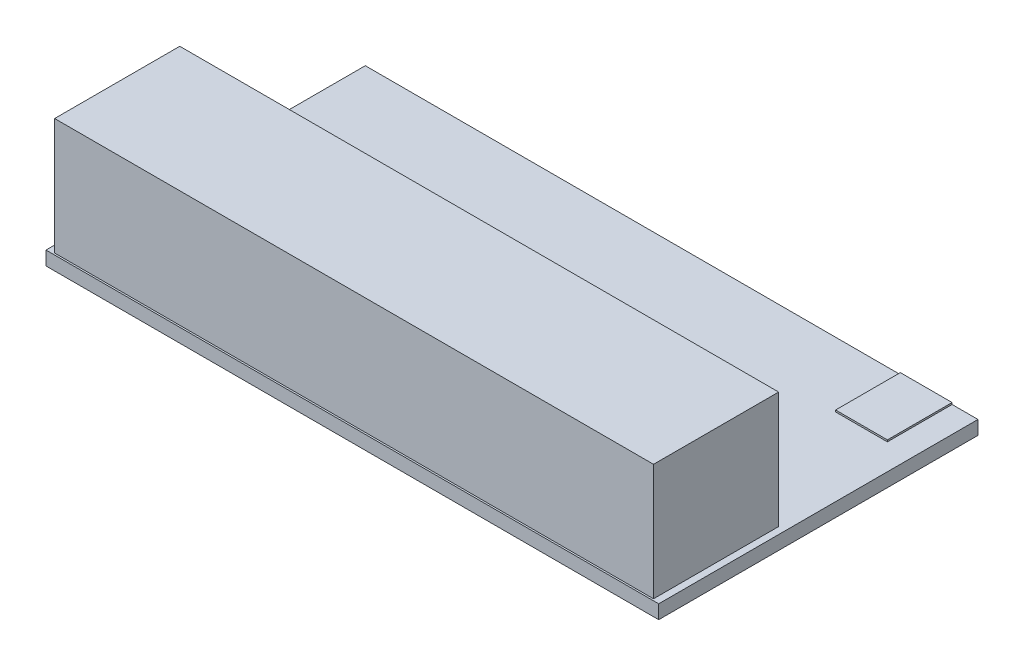
ISO-10303-21;
HEADER;
FILE_DESCRIPTION(('STEP AP214'),'2;1');
FILE_NAME('part.step','',(''),(''),'','','');
FILE_SCHEMA(('AUTOMOTIVE_DESIGN { 1 0 10303 214 1 1 1 1 }'));
ENDSEC;
DATA;
#1=APPLICATION_CONTEXT('core data for automotive mechanical design processes');
#2=APPLICATION_PROTOCOL_DEFINITION('international standard','automotive_design',2000,#1);
#3=PRODUCT_CONTEXT('',#1,'mechanical');
#4=PRODUCT('Part','Part','',(#3));
#5=PRODUCT_RELATED_PRODUCT_CATEGORY('part','',(#4));
#6=PRODUCT_DEFINITION_FORMATION('','',#4);
#7=PRODUCT_DEFINITION_CONTEXT('part definition',#1,'design');
#8=PRODUCT_DEFINITION('design','',#6,#7);
#9=PRODUCT_DEFINITION_SHAPE('','',#8);
#10=(LENGTH_UNIT() NAMED_UNIT(*) SI_UNIT(.MILLI.,.METRE.));
#11=(NAMED_UNIT(*) PLANE_ANGLE_UNIT() SI_UNIT($,.RADIAN.));
#12=(NAMED_UNIT(*) SI_UNIT($,.STERADIAN.) SOLID_ANGLE_UNIT());
#13=UNCERTAINTY_MEASURE_WITH_UNIT(LENGTH_MEASURE(1.E-05),#10,'distance_accuracy_value','');
#14=(GEOMETRIC_REPRESENTATION_CONTEXT(3) GLOBAL_UNCERTAINTY_ASSIGNED_CONTEXT((#13)) GLOBAL_UNIT_ASSIGNED_CONTEXT((#10,
#11,#12)) REPRESENTATION_CONTEXT('',''));
#15=CARTESIAN_POINT('',(0.,0.,0.));
#16=DIRECTION('',(0.,0.,1.));
#17=DIRECTION('',(1.,0.,0.));
#18=AXIS2_PLACEMENT_3D('',#15,#16,#17);
#19=CARTESIAN_POINT('',(0.,1.6,0.));
#20=DIRECTION('',(0.,-1.,0.));
#21=DIRECTION('',(0.,0.,-1.));
#22=AXIS2_PLACEMENT_3D('',#19,#20,#21);
#23=PLANE('',#22);
#24=DIRECTION('',(0.,0.,1.));
#25=VECTOR('',#24,1.);
#26=CARTESIAN_POINT('',(0.799999999999995,1.6,-14.7));
#27=LINE('',#26,#25);
#28=CARTESIAN_POINT('',(0.799999999999995,1.6,-14.7));
#29=VERTEX_POINT('',#28);
#30=CARTESIAN_POINT('',(0.799999999999993,1.6,-0.199999999999999));
#31=VERTEX_POINT('',#30);
#32=EDGE_CURVE('E144',#29,#31,#27,.T.);
#33=ORIENTED_EDGE('',*,*,#32,.F.);
#34=DIRECTION('',(-1.,0.,0.));
#35=VECTOR('',#34,1.);
#36=CARTESIAN_POINT('',(0.799999999999995,1.6,-14.7));
#37=LINE('',#36,#35);
#38=CARTESIAN_POINT('',(70.2,1.6,-14.7));
#39=VERTEX_POINT('',#38);
#40=EDGE_CURVE('E157',#39,#29,#37,.T.);
#41=ORIENTED_EDGE('',*,*,#40,.F.);
#42=DIRECTION('',(0.,0.,-1.));
#43=VECTOR('',#42,1.);
#44=CARTESIAN_POINT('',(70.2,1.6,-14.7));
#45=LINE('',#44,#43);
#46=CARTESIAN_POINT('',(70.2,1.6,-0.199999999999999));
#47=VERTEX_POINT('',#46);
#48=EDGE_CURVE('E166',#47,#39,#45,.T.);
#49=ORIENTED_EDGE('',*,*,#48,.F.);
#50=DIRECTION('',(1.,0.,0.));
#51=VECTOR('',#50,1.);
#52=CARTESIAN_POINT('',(0.799999999999993,1.6,-0.199999999999999));
#53=LINE('',#52,#51);
#54=EDGE_CURVE('E147',#31,#47,#53,.T.);
#55=ORIENTED_EDGE('',*,*,#54,.F.);
#56=EDGE_LOOP('',(#33,#41,#49,#55));
#57=FACE_BOUND('',#56,.T.);
#58=DIRECTION('',(0.,0.,-1.));
#59=VECTOR('',#58,1.);
#60=CARTESIAN_POINT('',(68.,1.6,-29.5));
#61=LINE('',#60,#59);
#62=CARTESIAN_POINT('',(68.,1.6,-29.5));
#63=VERTEX_POINT('',#62);
#64=CARTESIAN_POINT('',(68.,1.6,-37.));
#65=VERTEX_POINT('',#64);
#66=EDGE_CURVE('E49',#63,#65,#61,.T.);
#67=ORIENTED_EDGE('',*,*,#66,.F.);
#68=DIRECTION('',(1.,0.,0.));
#69=VECTOR('',#68,1.);
#70=CARTESIAN_POINT('',(68.,1.6,-29.5));
#71=LINE('',#70,#69);
#72=CARTESIAN_POINT('',(62.,1.6,-29.5));
#73=VERTEX_POINT('',#72);
#74=EDGE_CURVE('E53',#73,#63,#71,.T.);
#75=ORIENTED_EDGE('',*,*,#74,.F.);
#76=DIRECTION('',(0.,0.,1.));
#77=VECTOR('',#76,1.);
#78=CARTESIAN_POINT('',(62.,1.6,-29.5));
#79=LINE('',#78,#77);
#80=CARTESIAN_POINT('',(62.,1.6,-37.));
#81=VERTEX_POINT('',#80);
#82=EDGE_CURVE('E222',#81,#73,#79,.T.);
#83=ORIENTED_EDGE('',*,*,#82,.F.);
#84=DIRECTION('',(-1.,0.,0.));
#85=VECTOR('',#84,1.);
#86=CARTESIAN_POINT('',(0.,1.6,-37.));
#87=LINE('',#86,#85);
#88=CARTESIAN_POINT('',(0.,1.6,-37.));
#89=VERTEX_POINT('',#88);
#90=EDGE_CURVE('E191',#81,#89,#87,.T.);
#91=ORIENTED_EDGE('',*,*,#90,.T.);
#92=DIRECTION('',(0.,0.,1.));
#93=VECTOR('',#92,1.);
#94=CARTESIAN_POINT('',(0.,1.6,0.));
#95=LINE('',#94,#93);
#96=CARTESIAN_POINT('',(0.,1.6,0.));
#97=VERTEX_POINT('',#96);
#98=EDGE_CURVE('E183',#89,#97,#95,.T.);
#99=ORIENTED_EDGE('',*,*,#98,.T.);
#100=DIRECTION('',(1.,0.,0.));
#101=VECTOR('',#100,1.);
#102=CARTESIAN_POINT('',(0.,1.6,0.));
#103=LINE('',#102,#101);
#104=CARTESIAN_POINT('',(71.,1.6,0.));
#105=VERTEX_POINT('',#104);
#106=EDGE_CURVE('E186',#97,#105,#103,.T.);
#107=ORIENTED_EDGE('',*,*,#106,.T.);
#108=DIRECTION('',(0.,0.,-1.));
#109=VECTOR('',#108,1.);
#110=CARTESIAN_POINT('',(71.,1.6,0.));
#111=LINE('',#110,#109);
#112=CARTESIAN_POINT('',(71.,1.6,-37.));
#113=VERTEX_POINT('',#112);
#114=EDGE_CURVE('E189',#105,#113,#111,.T.);
#115=ORIENTED_EDGE('',*,*,#114,.T.);
#116=EDGE_CURVE('E192',#113,#65,#87,.T.);
#117=ORIENTED_EDGE('',*,*,#116,.T.);
#118=EDGE_LOOP('',(#67,#75,#83,#91,#99,#107,#115,#117));
#119=FACE_BOUND('',#118,.T.);
#120=ADVANCED_FACE('F34',(#57,#119),#23,.F.);
#121=CARTESIAN_POINT('',(0.,1.6,0.));
#122=DIRECTION('',(1.,0.,0.));
#123=DIRECTION('',(0.,0.,-1.));
#124=AXIS2_PLACEMENT_3D('',#121,#122,#123);
#125=PLANE('',#124);
#126=DIRECTION('',(0.,0.,1.));
#127=VECTOR('',#126,1.);
#128=CARTESIAN_POINT('',(0.,0.,0.));
#129=LINE('',#128,#127);
#130=CARTESIAN_POINT('',(0.,0.,-37.));
#131=VERTEX_POINT('',#130);
#132=CARTESIAN_POINT('',(0.,0.,0.));
#133=VERTEX_POINT('',#132);
#134=EDGE_CURVE('E182',#131,#133,#129,.T.);
#135=ORIENTED_EDGE('',*,*,#134,.T.);
#136=DIRECTION('',(0.,-1.,0.));
#137=VECTOR('',#136,1.);
#138=CARTESIAN_POINT('',(0.,1.6,0.));
#139=LINE('',#138,#137);
#140=EDGE_CURVE('E11',#97,#133,#139,.T.);
#141=ORIENTED_EDGE('',*,*,#140,.F.);
#142=ORIENTED_EDGE('',*,*,#98,.F.);
#143=DIRECTION('',(0.,-1.,0.));
#144=VECTOR('',#143,1.);
#145=CARTESIAN_POINT('',(0.,1.6,-37.));
#146=LINE('',#145,#144);
#147=EDGE_CURVE('E194',#89,#131,#146,.T.);
#148=ORIENTED_EDGE('',*,*,#147,.T.);
#149=EDGE_LOOP('',(#135,#141,#142,#148));
#150=FACE_BOUND('',#149,.T.);
#151=ADVANCED_FACE('F36',(#150),#125,.F.);
#152=CARTESIAN_POINT('',(0.,1.6,0.));
#153=DIRECTION('',(0.,0.,-1.));
#154=DIRECTION('',(-1.,0.,0.));
#155=AXIS2_PLACEMENT_3D('',#152,#153,#154);
#156=PLANE('',#155);
#157=DIRECTION('',(1.,0.,0.));
#158=VECTOR('',#157,1.);
#159=CARTESIAN_POINT('',(0.,0.,0.));
#160=LINE('',#159,#158);
#161=CARTESIAN_POINT('',(71.,0.,0.));
#162=VERTEX_POINT('',#161);
#163=EDGE_CURVE('E197',#133,#162,#160,.T.);
#164=ORIENTED_EDGE('',*,*,#163,.T.);
#165=DIRECTION('',(0.,-1.,0.));
#166=VECTOR('',#165,1.);
#167=CARTESIAN_POINT('',(71.,1.6,0.));
#168=LINE('',#167,#166);
#169=EDGE_CURVE('E42',#105,#162,#168,.T.);
#170=ORIENTED_EDGE('',*,*,#169,.F.);
#171=ORIENTED_EDGE('',*,*,#106,.F.);
#172=ORIENTED_EDGE('',*,*,#140,.T.);
#173=EDGE_LOOP('',(#164,#170,#171,#172));
#174=FACE_BOUND('',#173,.T.);
#175=ADVANCED_FACE('F250',(#174),#156,.F.);
#176=CARTESIAN_POINT('',(71.,1.6,0.));
#177=DIRECTION('',(-1.,0.,0.));
#178=DIRECTION('',(0.,0.,1.));
#179=AXIS2_PLACEMENT_3D('',#176,#177,#178);
#180=PLANE('',#179);
#181=DIRECTION('',(0.,0.,-1.));
#182=VECTOR('',#181,1.);
#183=CARTESIAN_POINT('',(71.,0.,0.));
#184=LINE('',#183,#182);
#185=CARTESIAN_POINT('',(71.,0.,-37.));
#186=VERTEX_POINT('',#185);
#187=EDGE_CURVE('E199',#162,#186,#184,.T.);
#188=ORIENTED_EDGE('',*,*,#187,.T.);
#189=DIRECTION('',(0.,-1.,0.));
#190=VECTOR('',#189,1.);
#191=CARTESIAN_POINT('',(71.,1.6,-37.));
#192=LINE('',#191,#190);
#193=EDGE_CURVE('E204',#113,#186,#192,.T.);
#194=ORIENTED_EDGE('',*,*,#193,.F.);
#195=ORIENTED_EDGE('',*,*,#114,.F.);
#196=ORIENTED_EDGE('',*,*,#169,.T.);
#197=EDGE_LOOP('',(#188,#194,#195,#196));
#198=FACE_BOUND('',#197,.T.);
#199=ADVANCED_FACE('F211',(#198),#180,.F.);
#200=CARTESIAN_POINT('',(0.,1.6,-37.));
#201=DIRECTION('',(0.,0.,1.));
#202=DIRECTION('',(1.,0.,0.));
#203=AXIS2_PLACEMENT_3D('',#200,#201,#202);
#204=PLANE('',#203);
#205=DIRECTION('',(-1.,0.,0.));
#206=VECTOR('',#205,1.);
#207=CARTESIAN_POINT('',(0.,0.,-37.));
#208=LINE('',#207,#206);
#209=EDGE_CURVE('E187',#186,#131,#208,.T.);
#210=ORIENTED_EDGE('',*,*,#209,.T.);
#211=ORIENTED_EDGE('',*,*,#147,.F.);
#212=ORIENTED_EDGE('',*,*,#90,.F.);
#213=DIRECTION('',(0.,-1.,0.));
#214=VECTOR('',#213,1.);
#215=CARTESIAN_POINT('',(62.,1.8,-37.));
#216=LINE('',#215,#214);
#217=CARTESIAN_POINT('',(62.,1.8,-37.));
#218=VERTEX_POINT('',#217);
#219=EDGE_CURVE('E129',#218,#81,#216,.T.);
#220=ORIENTED_EDGE('',*,*,#219,.F.);
#221=DIRECTION('',(-1.,0.,0.));
#222=VECTOR('',#221,1.);
#223=CARTESIAN_POINT('',(68.,1.8,-37.));
#224=LINE('',#223,#222);
#225=CARTESIAN_POINT('',(68.,1.8,-37.));
#226=VERTEX_POINT('',#225);
#227=EDGE_CURVE('E122',#226,#218,#224,.T.);
#228=ORIENTED_EDGE('',*,*,#227,.F.);
#229=DIRECTION('',(0.,-1.,0.));
#230=VECTOR('',#229,1.);
#231=CARTESIAN_POINT('',(68.,1.8,-37.));
#232=LINE('',#231,#230);
#233=EDGE_CURVE('E127',#226,#65,#232,.T.);
#234=ORIENTED_EDGE('',*,*,#233,.T.);
#235=ORIENTED_EDGE('',*,*,#116,.F.);
#236=ORIENTED_EDGE('',*,*,#193,.T.);
#237=EDGE_LOOP('',(#210,#211,#212,#220,#228,#234,#235,#236));
#238=FACE_BOUND('',#237,.T.);
#239=ADVANCED_FACE('F124',(#238),#204,.F.);
#240=CARTESIAN_POINT('',(0.,0.,0.));
#241=DIRECTION('',(0.,-1.,0.));
#242=DIRECTION('',(0.,0.,-1.));
#243=AXIS2_PLACEMENT_3D('',#240,#241,#242);
#244=PLANE('',#243);
#245=ORIENTED_EDGE('',*,*,#134,.F.);
#246=ORIENTED_EDGE('',*,*,#209,.F.);
#247=ORIENTED_EDGE('',*,*,#187,.F.);
#248=ORIENTED_EDGE('',*,*,#163,.F.);
#249=EDGE_LOOP('',(#245,#246,#247,#248));
#250=FACE_BOUND('',#249,.T.);
#251=ADVANCED_FACE('F217',(#250),#244,.T.);
#252=CARTESIAN_POINT('',(0.799999999999995,15.1,-14.7));
#253=DIRECTION('',(1.,0.,0.));
#254=DIRECTION('',(0.,0.,-1.));
#255=AXIS2_PLACEMENT_3D('',#252,#253,#254);
#256=PLANE('',#255);
#257=ORIENTED_EDGE('',*,*,#32,.T.);
#258=DIRECTION('',(0.,-1.,0.));
#259=VECTOR('',#258,1.);
#260=CARTESIAN_POINT('',(0.799999999999993,15.1,-0.199999999999999));
#261=LINE('',#260,#259);
#262=CARTESIAN_POINT('',(0.799999999999993,15.1,-0.199999999999999));
#263=VERTEX_POINT('',#262);
#264=EDGE_CURVE('E179',#263,#31,#261,.T.);
#265=ORIENTED_EDGE('',*,*,#264,.F.);
#266=DIRECTION('',(0.,0.,1.));
#267=VECTOR('',#266,1.);
#268=CARTESIAN_POINT('',(0.799999999999995,15.1,-14.7));
#269=LINE('',#268,#267);
#270=CARTESIAN_POINT('',(0.799999999999995,15.1,-14.7));
#271=VERTEX_POINT('',#270);
#272=EDGE_CURVE('E153',#271,#263,#269,.T.);
#273=ORIENTED_EDGE('',*,*,#272,.F.);
#274=DIRECTION('',(0.,-1.,0.));
#275=VECTOR('',#274,1.);
#276=CARTESIAN_POINT('',(0.799999999999995,15.1,-14.7));
#277=LINE('',#276,#275);
#278=EDGE_CURVE('E162',#271,#29,#277,.T.);
#279=ORIENTED_EDGE('',*,*,#278,.T.);
#280=EDGE_LOOP('',(#257,#265,#273,#279));
#281=FACE_BOUND('',#280,.T.);
#282=ADVANCED_FACE('F253',(#281),#256,.F.);
#283=CARTESIAN_POINT('',(0.799999999999993,15.1,-0.199999999999999));
#284=DIRECTION('',(0.,0.,-1.));
#285=DIRECTION('',(-1.,0.,0.));
#286=AXIS2_PLACEMENT_3D('',#283,#284,#285);
#287=PLANE('',#286);
#288=ORIENTED_EDGE('',*,*,#54,.T.);
#289=DIRECTION('',(0.,-1.,0.));
#290=VECTOR('',#289,1.);
#291=CARTESIAN_POINT('',(70.2,15.1,-0.199999999999999));
#292=LINE('',#291,#290);
#293=CARTESIAN_POINT('',(70.2,15.1,-0.199999999999999));
#294=VERTEX_POINT('',#293);
#295=EDGE_CURVE('E176',#294,#47,#292,.T.);
#296=ORIENTED_EDGE('',*,*,#295,.F.);
#297=DIRECTION('',(1.,0.,0.));
#298=VECTOR('',#297,1.);
#299=CARTESIAN_POINT('',(0.799999999999993,15.1,-0.199999999999999));
#300=LINE('',#299,#298);
#301=EDGE_CURVE('E156',#263,#294,#300,.T.);
#302=ORIENTED_EDGE('',*,*,#301,.F.);
#303=ORIENTED_EDGE('',*,*,#264,.T.);
#304=EDGE_LOOP('',(#288,#296,#302,#303));
#305=FACE_BOUND('',#304,.T.);
#306=ADVANCED_FACE('F284',(#305),#287,.F.);
#307=CARTESIAN_POINT('',(70.2,15.1,-14.7));
#308=DIRECTION('',(-1.,0.,0.));
#309=DIRECTION('',(0.,0.,1.));
#310=AXIS2_PLACEMENT_3D('',#307,#308,#309);
#311=PLANE('',#310);
#312=ORIENTED_EDGE('',*,*,#48,.T.);
#313=DIRECTION('',(0.,-1.,0.));
#314=VECTOR('',#313,1.);
#315=CARTESIAN_POINT('',(70.2,15.1,-14.7));
#316=LINE('',#315,#314);
#317=CARTESIAN_POINT('',(70.2,15.1,-14.7));
#318=VERTEX_POINT('',#317);
#319=EDGE_CURVE('E173',#318,#39,#316,.T.);
#320=ORIENTED_EDGE('',*,*,#319,.F.);
#321=DIRECTION('',(0.,0.,-1.));
#322=VECTOR('',#321,1.);
#323=CARTESIAN_POINT('',(70.2,15.1,-14.7));
#324=LINE('',#323,#322);
#325=EDGE_CURVE('E159',#294,#318,#324,.T.);
#326=ORIENTED_EDGE('',*,*,#325,.F.);
#327=ORIENTED_EDGE('',*,*,#295,.T.);
#328=EDGE_LOOP('',(#312,#320,#326,#327));
#329=FACE_BOUND('',#328,.T.);
#330=ADVANCED_FACE('F292',(#329),#311,.F.);
#331=CARTESIAN_POINT('',(0.799999999999995,15.1,-14.7));
#332=DIRECTION('',(0.,0.,1.));
#333=DIRECTION('',(1.,0.,0.));
#334=AXIS2_PLACEMENT_3D('',#331,#332,#333);
#335=PLANE('',#334);
#336=ORIENTED_EDGE('',*,*,#40,.T.);
#337=ORIENTED_EDGE('',*,*,#278,.F.);
#338=DIRECTION('',(-1.,0.,0.));
#339=VECTOR('',#338,1.);
#340=CARTESIAN_POINT('',(0.799999999999995,15.1,-14.7));
#341=LINE('',#340,#339);
#342=EDGE_CURVE('E161',#318,#271,#341,.T.);
#343=ORIENTED_EDGE('',*,*,#342,.F.);
#344=ORIENTED_EDGE('',*,*,#319,.T.);
#345=EDGE_LOOP('',(#336,#337,#343,#344));
#346=FACE_BOUND('',#345,.T.);
#347=ADVANCED_FACE('F298',(#346),#335,.F.);
#348=CARTESIAN_POINT('',(0.,15.1,0.));
#349=DIRECTION('',(0.,1.,0.));
#350=DIRECTION('',(0.,0.,1.));
#351=AXIS2_PLACEMENT_3D('',#348,#349,#350);
#352=PLANE('',#351);
#353=ORIENTED_EDGE('',*,*,#272,.T.);
#354=ORIENTED_EDGE('',*,*,#301,.T.);
#355=ORIENTED_EDGE('',*,*,#325,.T.);
#356=ORIENTED_EDGE('',*,*,#342,.T.);
#357=EDGE_LOOP('',(#353,#354,#355,#356));
#358=FACE_BOUND('',#357,.T.);
#359=ADVANCED_FACE('F306',(#358),#352,.T.);
#360=CARTESIAN_POINT('',(68.,1.8,-29.5));
#361=DIRECTION('',(-1.,0.,0.));
#362=DIRECTION('',(0.,0.,1.));
#363=AXIS2_PLACEMENT_3D('',#360,#361,#362);
#364=PLANE('',#363);
#365=ORIENTED_EDGE('',*,*,#66,.T.);
#366=ORIENTED_EDGE('',*,*,#233,.F.);
#367=DIRECTION('',(0.,0.,-1.));
#368=VECTOR('',#367,1.);
#369=CARTESIAN_POINT('',(68.,1.8,-29.5));
#370=LINE('',#369,#368);
#371=CARTESIAN_POINT('',(68.,1.8,-29.5));
#372=VERTEX_POINT('',#371);
#373=EDGE_CURVE('E133',#372,#226,#370,.T.);
#374=ORIENTED_EDGE('',*,*,#373,.F.);
#375=DIRECTION('',(0.,-1.,0.));
#376=VECTOR('',#375,1.);
#377=CARTESIAN_POINT('',(68.,1.8,-29.5));
#378=LINE('',#377,#376);
#379=EDGE_CURVE('E229',#372,#63,#378,.T.);
#380=ORIENTED_EDGE('',*,*,#379,.T.);
#381=EDGE_LOOP('',(#365,#366,#374,#380));
#382=FACE_BOUND('',#381,.T.);
#383=ADVANCED_FACE('F143',(#382),#364,.F.);
#384=CARTESIAN_POINT('',(62.,1.8,-29.5));
#385=DIRECTION('',(1.,0.,0.));
#386=DIRECTION('',(0.,0.,-1.));
#387=AXIS2_PLACEMENT_3D('',#384,#385,#386);
#388=PLANE('',#387);
#389=ORIENTED_EDGE('',*,*,#82,.T.);
#390=DIRECTION('',(0.,-1.,0.));
#391=VECTOR('',#390,1.);
#392=CARTESIAN_POINT('',(62.,1.8,-29.5));
#393=LINE('',#392,#391);
#394=CARTESIAN_POINT('',(62.,1.8,-29.5));
#395=VERTEX_POINT('',#394);
#396=EDGE_CURVE('E149',#395,#73,#393,.T.);
#397=ORIENTED_EDGE('',*,*,#396,.F.);
#398=DIRECTION('',(0.,0.,1.));
#399=VECTOR('',#398,1.);
#400=CARTESIAN_POINT('',(62.,1.8,-29.5));
#401=LINE('',#400,#399);
#402=EDGE_CURVE('E132',#218,#395,#401,.T.);
#403=ORIENTED_EDGE('',*,*,#402,.F.);
#404=ORIENTED_EDGE('',*,*,#219,.T.);
#405=EDGE_LOOP('',(#389,#397,#403,#404));
#406=FACE_BOUND('',#405,.T.);
#407=ADVANCED_FACE('F227',(#406),#388,.F.);
#408=CARTESIAN_POINT('',(68.,1.8,-29.5));
#409=DIRECTION('',(0.,0.,-1.));
#410=DIRECTION('',(-1.,0.,0.));
#411=AXIS2_PLACEMENT_3D('',#408,#409,#410);
#412=PLANE('',#411);
#413=ORIENTED_EDGE('',*,*,#74,.T.);
#414=ORIENTED_EDGE('',*,*,#379,.F.);
#415=DIRECTION('',(1.,0.,0.));
#416=VECTOR('',#415,1.);
#417=CARTESIAN_POINT('',(68.,1.8,-29.5));
#418=LINE('',#417,#416);
#419=EDGE_CURVE('E138',#395,#372,#418,.T.);
#420=ORIENTED_EDGE('',*,*,#419,.F.);
#421=ORIENTED_EDGE('',*,*,#396,.T.);
#422=EDGE_LOOP('',(#413,#414,#420,#421));
#423=FACE_BOUND('',#422,.T.);
#424=ADVANCED_FACE('F235',(#423),#412,.F.);
#425=CARTESIAN_POINT('',(0.,1.8,0.));
#426=DIRECTION('',(0.,1.,0.));
#427=DIRECTION('',(0.,0.,1.));
#428=AXIS2_PLACEMENT_3D('',#425,#426,#427);
#429=PLANE('',#428);
#430=ORIENTED_EDGE('',*,*,#373,.T.);
#431=ORIENTED_EDGE('',*,*,#227,.T.);
#432=ORIENTED_EDGE('',*,*,#402,.T.);
#433=ORIENTED_EDGE('',*,*,#419,.T.);
#434=EDGE_LOOP('',(#430,#431,#432,#433));
#435=FACE_BOUND('',#434,.T.);
#436=ADVANCED_FACE('F136',(#435),#429,.T.);
#437=CLOSED_SHELL('',(#120,#151,#175,#199,#239,#251,#282,#306,#330,#347,#359,#383,#407,#424,#436));
#438=MANIFOLD_SOLID_BREP('B2',#437);
#439=ADVANCED_BREP_SHAPE_REPRESENTATION('',(#18,#438),#14);
#440=SHAPE_DEFINITION_REPRESENTATION(#9,#439);
ENDSEC;
END-ISO-10303-21;
